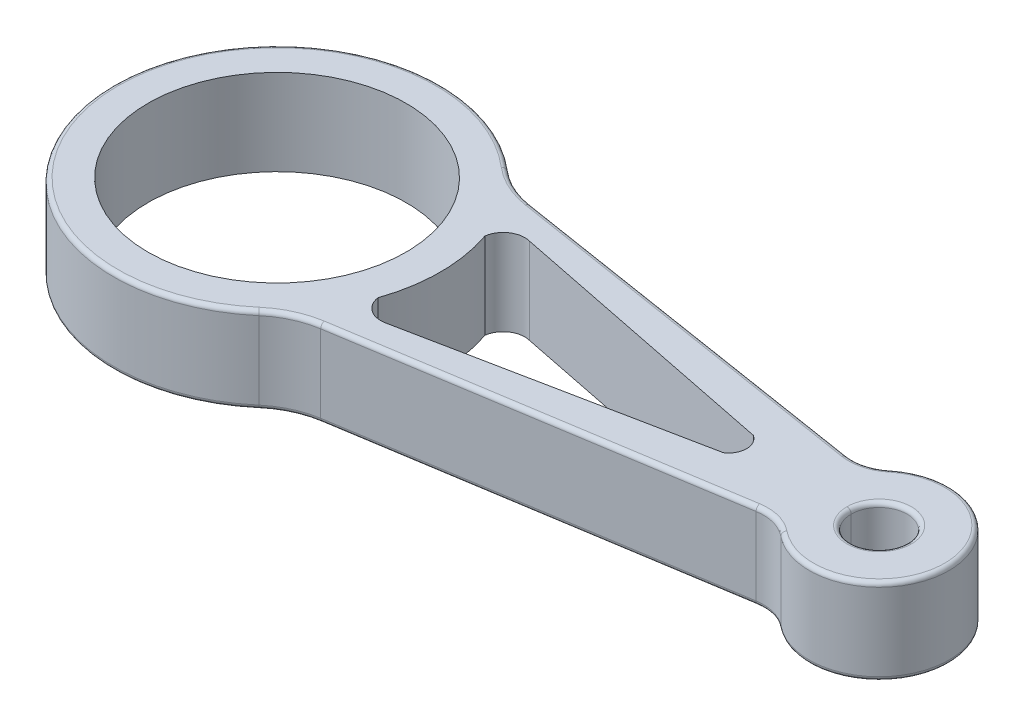
ISO-10303-21;
HEADER;
FILE_DESCRIPTION(('STEP AP214'),'2;1');
FILE_NAME('part.step','',(''),(''),'','','');
FILE_SCHEMA(('AUTOMOTIVE_DESIGN { 1 0 10303 214 1 1 1 1 }'));
ENDSEC;
DATA;
#1=APPLICATION_CONTEXT('core data for automotive mechanical design processes');
#2=APPLICATION_PROTOCOL_DEFINITION('international standard','automotive_design',2000,#1);
#3=PRODUCT_CONTEXT('',#1,'mechanical');
#4=PRODUCT('Part','Part','',(#3));
#5=PRODUCT_RELATED_PRODUCT_CATEGORY('part','',(#4));
#6=PRODUCT_DEFINITION_FORMATION('','',#4);
#7=PRODUCT_DEFINITION_CONTEXT('part definition',#1,'design');
#8=PRODUCT_DEFINITION('design','',#6,#7);
#9=PRODUCT_DEFINITION_SHAPE('','',#8);
#10=(LENGTH_UNIT() NAMED_UNIT(*) SI_UNIT(.MILLI.,.METRE.));
#11=(NAMED_UNIT(*) PLANE_ANGLE_UNIT() SI_UNIT($,.RADIAN.));
#12=(NAMED_UNIT(*) SI_UNIT($,.STERADIAN.) SOLID_ANGLE_UNIT());
#13=UNCERTAINTY_MEASURE_WITH_UNIT(LENGTH_MEASURE(1.E-05),#10,'distance_accuracy_value','');
#14=(GEOMETRIC_REPRESENTATION_CONTEXT(3) GLOBAL_UNCERTAINTY_ASSIGNED_CONTEXT((#13)) GLOBAL_UNIT_ASSIGNED_CONTEXT((#10,
#11,#12)) REPRESENTATION_CONTEXT('',''));
#15=CARTESIAN_POINT('',(0.,0.,0.));
#16=DIRECTION('',(0.,0.,1.));
#17=DIRECTION('',(1.,0.,0.));
#18=AXIS2_PLACEMENT_3D('',#15,#16,#17);
#19=CARTESIAN_POINT('',(140.,10.,0.));
#20=DIRECTION('',(0.,-1.,0.));
#21=DIRECTION('',(0.,0.,-1.));
#22=AXIS2_PLACEMENT_3D('',#19,#20,#21);
#23=CYLINDRICAL_SURFACE('',#22,6.50000000000002);
#24=DIRECTION('',(0.,1.,0.));
#25=VECTOR('',#24,1.);
#26=CARTESIAN_POINT('',(146.5,10.,0.));
#27=LINE('',#26,#25);
#28=CARTESIAN_POINT('',(146.5,-9.,0.));
#29=VERTEX_POINT('',#28);
#30=CARTESIAN_POINT('',(146.5,9.,0.));
#31=VERTEX_POINT('',#30);
#32=EDGE_CURVE('E304',#29,#31,#27,.T.);
#33=ORIENTED_EDGE('',*,*,#32,.T.);
#34=CARTESIAN_POINT('',(140.,9.,0.));
#35=DIRECTION('',(0.,1.,0.));
#36=DIRECTION('',(0.,0.,1.));
#37=AXIS2_PLACEMENT_3D('',#34,#35,#36);
#38=CIRCLE('',#37,6.50000000000002);
#39=CARTESIAN_POINT('',(133.5,9.,0.));
#40=VERTEX_POINT('',#39);
#41=EDGE_CURVE('E314',#31,#40,#38,.T.);
#42=ORIENTED_EDGE('',*,*,#41,.T.);
#43=DIRECTION('',(0.,-1.,0.));
#44=VECTOR('',#43,1.);
#45=CARTESIAN_POINT('',(133.5,10.,0.));
#46=LINE('',#45,#44);
#47=CARTESIAN_POINT('',(133.5,-9.,0.));
#48=VERTEX_POINT('',#47);
#49=EDGE_CURVE('E308',#40,#48,#46,.T.);
#50=ORIENTED_EDGE('',*,*,#49,.T.);
#51=CARTESIAN_POINT('',(140.,-9.,0.));
#52=DIRECTION('',(0.,1.,0.));
#53=DIRECTION('',(0.,0.,1.));
#54=AXIS2_PLACEMENT_3D('',#51,#52,#53);
#55=CIRCLE('',#54,6.50000000000002);
#56=EDGE_CURVE('E312',#48,#29,#55,.F.);
#57=ORIENTED_EDGE('',*,*,#56,.T.);
#58=EDGE_LOOP('',(#33,#42,#50,#57));
#59=FACE_BOUND('',#58,.T.);
#60=ADVANCED_FACE('F41',(#59),#23,.F.);
#61=CARTESIAN_POINT('',(0.,10.,0.));
#62=DIRECTION('',(0.,1.,0.));
#63=DIRECTION('',(0.,0.,1.));
#64=AXIS2_PLACEMENT_3D('',#61,#62,#63);
#65=PLANE('',#64);
#66=CARTESIAN_POINT('',(140.,10.,0.));
#67=DIRECTION('',(0.,1.,0.));
#68=DIRECTION('',(0.,0.,1.));
#69=AXIS2_PLACEMENT_3D('',#66,#67,#68);
#70=CIRCLE('',#69,7.50000000000002);
#71=CARTESIAN_POINT('',(147.5,10.,0.));
#72=VERTEX_POINT('',#71);
#73=CARTESIAN_POINT('',(132.5,10.,0.));
#74=VERTEX_POINT('',#73);
#75=EDGE_CURVE('E334',#72,#74,#70,.F.);
#76=ORIENTED_EDGE('',*,*,#75,.T.);
#77=CARTESIAN_POINT('',(140.,10.,0.));
#78=DIRECTION('',(0.,1.,0.));
#79=DIRECTION('',(0.,0.,1.));
#80=AXIS2_PLACEMENT_3D('',#77,#78,#79);
#81=CIRCLE('',#80,7.50000000000002);
#82=EDGE_CURVE('E336',#74,#72,#81,.F.);
#83=ORIENTED_EDGE('',*,*,#82,.T.);
#84=EDGE_LOOP('',(#76,#83));
#85=FACE_BOUND('',#84,.T.);
#86=DIRECTION('',(0.98768997143747,0.,-0.15642416795959));
#87=VECTOR('',#86,1.);
#88=CARTESIAN_POINT('',(121.760856010364,10.,9.53644901003842));
#89=LINE('',#88,#87);
#90=CARTESIAN_POINT('',(34.3647591369762,10.,23.3776969032807));
#91=VERTEX_POINT('',#90);
#92=CARTESIAN_POINT('',(121.760856010364,10.,9.53644901003843));
#93=VERTEX_POINT('',#92);
#94=EDGE_CURVE('E329',#91,#93,#89,.T.);
#95=ORIENTED_EDGE('',*,*,#94,.T.);
#96=CARTESIAN_POINT('',(123.481521857919,10.,20.4010386958506));
#97=DIRECTION('',(0.,1.,0.));
#98=DIRECTION('',(0.,0.,1.));
#99=AXIS2_PLACEMENT_3D('',#96,#97,#98);
#100=CIRCLE('',#99,11.);
#101=CARTESIAN_POINT('',(130.403550793648,10.,11.8520320042561));
#102=VERTEX_POINT('',#101);
#103=EDGE_CURVE('E331',#93,#102,#100,.F.);
#104=ORIENTED_EDGE('',*,*,#103,.T.);
#105=CARTESIAN_POINT('',(140.,10.,0.));
#106=DIRECTION('',(0.,1.,0.));
#107=DIRECTION('',(0.,0.,1.));
#108=AXIS2_PLACEMENT_3D('',#105,#106,#107);
#109=CIRCLE('',#108,15.25);
#110=CARTESIAN_POINT('',(130.403550793648,10.,-11.8520320042561));
#111=VERTEX_POINT('',#110);
#112=EDGE_CURVE('E317',#102,#111,#109,.T.);
#113=ORIENTED_EDGE('',*,*,#112,.T.);
#114=CARTESIAN_POINT('',(123.481521857919,10.,-20.4010386958506));
#115=DIRECTION('',(0.,1.,0.));
#116=DIRECTION('',(0.,0.,1.));
#117=AXIS2_PLACEMENT_3D('',#114,#115,#116);
#118=CIRCLE('',#117,11.);
#119=CARTESIAN_POINT('',(121.760856010364,10.,-9.53644901003843));
#120=VERTEX_POINT('',#119);
#121=EDGE_CURVE('E319',#111,#120,#118,.F.);
#122=ORIENTED_EDGE('',*,*,#121,.T.);
#123=DIRECTION('',(-0.98768997143747,0.,-0.15642416795959));
#124=VECTOR('',#123,1.);
#125=CARTESIAN_POINT('',(34.3647591369762,10.,-23.3776969032807));
#126=LINE('',#125,#124);
#127=CARTESIAN_POINT('',(34.3647591369762,10.,-23.3776969032807));
#128=VERTEX_POINT('',#127);
#129=EDGE_CURVE('E321',#120,#128,#126,.T.);
#130=ORIENTED_EDGE('',*,*,#129,.T.);
#131=CARTESIAN_POINT('',(37.6496666641276,10.,-44.1191863034676));
#132=DIRECTION('',(0.,1.,0.));
#133=DIRECTION('',(0.,0.,1.));
#134=AXIS2_PLACEMENT_3D('',#131,#132,#133);
#135=CIRCLE('',#134,21.);
#136=CARTESIAN_POINT('',(24.0178908029779,10.,-28.1449981591086));
#137=VERTEX_POINT('',#136);
#138=EDGE_CURVE('E323',#128,#137,#135,.F.);
#139=ORIENTED_EDGE('',*,*,#138,.T.);
#140=CARTESIAN_POINT('',(0.,10.,0.));
#141=DIRECTION('',(0.,1.,0.));
#142=DIRECTION('',(0.,0.,1.));
#143=AXIS2_PLACEMENT_3D('',#140,#141,#142);
#144=CIRCLE('',#143,37.);
#145=CARTESIAN_POINT('',(24.0178908029779,10.,28.1449981591086));
#146=VERTEX_POINT('',#145);
#147=EDGE_CURVE('E325',#137,#146,#144,.T.);
#148=ORIENTED_EDGE('',*,*,#147,.T.);
#149=CARTESIAN_POINT('',(37.6496666641276,10.,44.1191863034676));
#150=DIRECTION('',(0.,1.,0.));
#151=DIRECTION('',(0.,0.,1.));
#152=AXIS2_PLACEMENT_3D('',#149,#150,#151);
#153=CIRCLE('',#152,21.);
#154=EDGE_CURVE('E327',#146,#91,#153,.F.);
#155=ORIENTED_EDGE('',*,*,#154,.T.);
#156=EDGE_LOOP('',(#95,#104,#113,#122,#130,#139,#148,#155));
#157=FACE_BOUND('',#156,.T.);
#158=CARTESIAN_POINT('',(40.8525256208272,10.,-11.7407048710844));
#159=DIRECTION('',(0.,-1.,0.));
#160=DIRECTION('',(0.,0.,-1.));
#161=AXIS2_PLACEMENT_3D('',#158,#159,#160);
#162=CIRCLE('',#161,5.);
#163=CARTESIAN_POINT('',(35.9029509891441,10.,-12.4490204542813));
#164=VERTEX_POINT('',#163);
#165=CARTESIAN_POINT('',(42.0845930208549,10.,-16.5865288383565));
#166=VERTEX_POINT('',#165);
#167=EDGE_CURVE('E220',#164,#166,#162,.T.);
#168=ORIENTED_EDGE('',*,*,#167,.T.);
#169=DIRECTION('',(0.980410813958702,0.,0.196963539450417));
#170=VECTOR('',#169,1.);
#171=CARTESIAN_POINT('',(42.0845930208549,10.,-16.5865288383565));
#172=LINE('',#171,#170);
#173=CARTESIAN_POINT('',(107.258618966353,10.,-3.49313304172539));
#174=VERTEX_POINT('',#173);
#175=EDGE_CURVE('E232',#166,#174,#172,.T.);
#176=ORIENTED_EDGE('',*,*,#175,.T.);
#177=CARTESIAN_POINT('',(105.,10.,0.));
#178=DIRECTION('',(0.,-1.,0.));
#179=DIRECTION('',(0.,0.,-1.));
#180=AXIS2_PLACEMENT_3D('',#177,#178,#179);
#181=CIRCLE('',#180,4.15972812601523);
#182=CARTESIAN_POINT('',(107.258618966353,10.,3.49313304172539));
#183=VERTEX_POINT('',#182);
#184=EDGE_CURVE('E236',#174,#183,#181,.T.);
#185=ORIENTED_EDGE('',*,*,#184,.T.);
#186=DIRECTION('',(-0.980410813958702,0.,0.196963539450417));
#187=VECTOR('',#186,1.);
#188=CARTESIAN_POINT('',(42.0845930208549,10.,16.5865288383565));
#189=LINE('',#188,#187);
#190=CARTESIAN_POINT('',(42.0845930208549,10.,16.5865288383565));
#191=VERTEX_POINT('',#190);
#192=EDGE_CURVE('E249',#183,#191,#189,.T.);
#193=ORIENTED_EDGE('',*,*,#192,.T.);
#194=CARTESIAN_POINT('',(40.8525256208272,10.,11.7407048710844));
#195=DIRECTION('',(0.,-1.,0.));
#196=DIRECTION('',(0.,0.,1.));
#197=AXIS2_PLACEMENT_3D('',#194,#195,#196);
#198=CIRCLE('',#197,5.);
#199=CARTESIAN_POINT('',(35.9029509891441,10.,12.4490204542813));
#200=VERTEX_POINT('',#199);
#201=EDGE_CURVE('E252',#191,#200,#198,.T.);
#202=ORIENTED_EDGE('',*,*,#201,.T.);
#203=CARTESIAN_POINT('',(0.,10.,0.));
#204=DIRECTION('',(0.,1.,0.));
#205=DIRECTION('',(0.,0.,-1.));
#206=AXIS2_PLACEMENT_3D('',#203,#204,#205);
#207=CIRCLE('',#206,38.);
#208=EDGE_CURVE('E228',#200,#164,#207,.T.);
#209=ORIENTED_EDGE('',*,*,#208,.T.);
#210=EDGE_LOOP('',(#168,#176,#185,#193,#202,#209));
#211=FACE_BOUND('',#210,.T.);
#212=CARTESIAN_POINT('',(0.,10.,0.));
#213=DIRECTION('',(0.,1.,0.));
#214=DIRECTION('',(0.,0.,1.));
#215=AXIS2_PLACEMENT_3D('',#212,#213,#214);
#216=CIRCLE('',#215,30.);
#217=CARTESIAN_POINT('',(0.,10.,30.));
#218=VERTEX_POINT('',#217);
#219=EDGE_CURVE('E277',#218,#218,#216,.T.);
#220=ORIENTED_EDGE('',*,*,#219,.F.);
#221=EDGE_LOOP('',(#220));
#222=FACE_BOUND('',#221,.T.);
#223=ADVANCED_FACE('F238',(#85,#157,#211,#222),#65,.T.);
#224=CARTESIAN_POINT('',(0.,-10.,0.));
#225=DIRECTION('',(0.,1.,0.));
#226=DIRECTION('',(0.,0.,1.));
#227=AXIS2_PLACEMENT_3D('',#224,#225,#226);
#228=PLANE('',#227);
#229=CARTESIAN_POINT('',(140.,-10.,0.));
#230=DIRECTION('',(0.,1.,0.));
#231=DIRECTION('',(0.,0.,1.));
#232=AXIS2_PLACEMENT_3D('',#229,#230,#231);
#233=CIRCLE('',#232,7.50000000000002);
#234=CARTESIAN_POINT('',(147.5,-10.,0.));
#235=VERTEX_POINT('',#234);
#236=CARTESIAN_POINT('',(132.5,-10.,0.));
#237=VERTEX_POINT('',#236);
#238=EDGE_CURVE('E356',#235,#237,#233,.T.);
#239=ORIENTED_EDGE('',*,*,#238,.T.);
#240=CARTESIAN_POINT('',(140.,-10.,0.));
#241=DIRECTION('',(0.,1.,0.));
#242=DIRECTION('',(0.,0.,1.));
#243=AXIS2_PLACEMENT_3D('',#240,#241,#242);
#244=CIRCLE('',#243,7.50000000000002);
#245=EDGE_CURVE('E358',#237,#235,#244,.T.);
#246=ORIENTED_EDGE('',*,*,#245,.T.);
#247=EDGE_LOOP('',(#239,#246));
#248=FACE_BOUND('',#247,.T.);
#249=CARTESIAN_POINT('',(140.,-10.,0.));
#250=DIRECTION('',(0.,1.,0.));
#251=DIRECTION('',(0.,0.,1.));
#252=AXIS2_PLACEMENT_3D('',#249,#250,#251);
#253=CIRCLE('',#252,15.25);
#254=CARTESIAN_POINT('',(130.403550793648,-10.,-11.8520320042561));
#255=VERTEX_POINT('',#254);
#256=CARTESIAN_POINT('',(130.403550793648,-10.,11.8520320042561));
#257=VERTEX_POINT('',#256);
#258=EDGE_CURVE('E339',#255,#257,#253,.F.);
#259=ORIENTED_EDGE('',*,*,#258,.T.);
#260=CARTESIAN_POINT('',(123.481521857919,-10.,20.4010386958506));
#261=DIRECTION('',(0.,1.,0.));
#262=DIRECTION('',(0.,0.,1.));
#263=AXIS2_PLACEMENT_3D('',#260,#261,#262);
#264=CIRCLE('',#263,11.);
#265=CARTESIAN_POINT('',(121.760856010364,-10.,9.53644901003843));
#266=VERTEX_POINT('',#265);
#267=EDGE_CURVE('E353',#257,#266,#264,.T.);
#268=ORIENTED_EDGE('',*,*,#267,.T.);
#269=DIRECTION('',(0.98768997143747,0.,-0.15642416795959));
#270=VECTOR('',#269,1.);
#271=CARTESIAN_POINT('',(4.45267582891042,-10.,28.114985808414));
#272=LINE('',#271,#270);
#273=CARTESIAN_POINT('',(34.3647591369762,-10.,23.3776969032807));
#274=VERTEX_POINT('',#273);
#275=EDGE_CURVE('E351',#266,#274,#272,.F.);
#276=ORIENTED_EDGE('',*,*,#275,.T.);
#277=CARTESIAN_POINT('',(37.6496666641276,-10.,44.1191863034676));
#278=DIRECTION('',(0.,1.,0.));
#279=DIRECTION('',(0.,0.,1.));
#280=AXIS2_PLACEMENT_3D('',#277,#278,#279);
#281=CIRCLE('',#280,21.);
#282=CARTESIAN_POINT('',(24.0178908029779,-10.,28.1449981591086));
#283=VERTEX_POINT('',#282);
#284=EDGE_CURVE('E349',#274,#283,#281,.T.);
#285=ORIENTED_EDGE('',*,*,#284,.T.);
#286=CARTESIAN_POINT('',(0.,-10.,0.));
#287=DIRECTION('',(0.,1.,0.));
#288=DIRECTION('',(0.,0.,1.));
#289=AXIS2_PLACEMENT_3D('',#286,#287,#288);
#290=CIRCLE('',#289,37.);
#291=CARTESIAN_POINT('',(24.0178908029779,-10.,-28.1449981591086));
#292=VERTEX_POINT('',#291);
#293=EDGE_CURVE('E347',#283,#292,#290,.F.);
#294=ORIENTED_EDGE('',*,*,#293,.T.);
#295=CARTESIAN_POINT('',(37.6496666641276,-10.,-44.1191863034676));
#296=DIRECTION('',(0.,1.,0.));
#297=DIRECTION('',(0.,0.,1.));
#298=AXIS2_PLACEMENT_3D('',#295,#296,#297);
#299=CIRCLE('',#298,21.);
#300=CARTESIAN_POINT('',(34.3647591369762,-10.,-23.3776969032807));
#301=VERTEX_POINT('',#300);
#302=EDGE_CURVE('E345',#292,#301,#299,.T.);
#303=ORIENTED_EDGE('',*,*,#302,.T.);
#304=DIRECTION('',(-0.98768997143747,0.,-0.15642416795959));
#305=VECTOR('',#304,1.);
#306=CARTESIAN_POINT('',(4.45267582891042,-10.,-28.114985808414));
#307=LINE('',#306,#305);
#308=CARTESIAN_POINT('',(121.760856010364,-10.,-9.53644901003843));
#309=VERTEX_POINT('',#308);
#310=EDGE_CURVE('E343',#301,#309,#307,.F.);
#311=ORIENTED_EDGE('',*,*,#310,.T.);
#312=CARTESIAN_POINT('',(123.481521857919,-10.,-20.4010386958506));
#313=DIRECTION('',(0.,1.,0.));
#314=DIRECTION('',(0.,0.,1.));
#315=AXIS2_PLACEMENT_3D('',#312,#313,#314);
#316=CIRCLE('',#315,11.);
#317=EDGE_CURVE('E341',#309,#255,#316,.T.);
#318=ORIENTED_EDGE('',*,*,#317,.T.);
#319=EDGE_LOOP('',(#259,#268,#276,#285,#294,#303,#311,#318));
#320=FACE_BOUND('',#319,.T.);
#321=DIRECTION('',(0.980410813958702,0.,0.196963539450417));
#322=VECTOR('',#321,1.);
#323=CARTESIAN_POINT('',(42.0845930208549,-10.,-16.5865288383565));
#324=LINE('',#323,#322);
#325=CARTESIAN_POINT('',(42.0845930208549,-10.,-16.5865288383565));
#326=VERTEX_POINT('',#325);
#327=CARTESIAN_POINT('',(107.258618966353,-10.,-3.49313304172539));
#328=VERTEX_POINT('',#327);
#329=EDGE_CURVE('E256',#326,#328,#324,.T.);
#330=ORIENTED_EDGE('',*,*,#329,.F.);
#331=CARTESIAN_POINT('',(40.8525256208272,-10.,-11.7407048710844));
#332=DIRECTION('',(0.,-1.,0.));
#333=DIRECTION('',(0.,0.,-1.));
#334=AXIS2_PLACEMENT_3D('',#331,#332,#333);
#335=CIRCLE('',#334,5.);
#336=CARTESIAN_POINT('',(35.9029509891441,-10.,-12.4490204542813));
#337=VERTEX_POINT('',#336);
#338=EDGE_CURVE('E223',#337,#326,#335,.T.);
#339=ORIENTED_EDGE('',*,*,#338,.F.);
#340=CARTESIAN_POINT('',(0.,-10.,0.));
#341=DIRECTION('',(0.,1.,0.));
#342=DIRECTION('',(0.,0.,-1.));
#343=AXIS2_PLACEMENT_3D('',#340,#341,#342);
#344=CIRCLE('',#343,38.);
#345=CARTESIAN_POINT('',(35.9029509891441,-10.,12.4490204542813));
#346=VERTEX_POINT('',#345);
#347=EDGE_CURVE('E242',#346,#337,#344,.T.);
#348=ORIENTED_EDGE('',*,*,#347,.F.);
#349=CARTESIAN_POINT('',(40.8525256208272,-10.,11.7407048710844));
#350=DIRECTION('',(0.,-1.,0.));
#351=DIRECTION('',(0.,0.,1.));
#352=AXIS2_PLACEMENT_3D('',#349,#350,#351);
#353=CIRCLE('',#352,5.);
#354=CARTESIAN_POINT('',(42.0845930208549,-10.,16.5865288383565));
#355=VERTEX_POINT('',#354);
#356=EDGE_CURVE('E245',#355,#346,#353,.T.);
#357=ORIENTED_EDGE('',*,*,#356,.F.);
#358=DIRECTION('',(-0.980410813958702,0.,0.196963539450417));
#359=VECTOR('',#358,1.);
#360=CARTESIAN_POINT('',(42.0845930208549,-10.,16.5865288383565));
#361=LINE('',#360,#359);
#362=CARTESIAN_POINT('',(107.258618966353,-10.,3.49313304172539));
#363=VERTEX_POINT('',#362);
#364=EDGE_CURVE('E262',#363,#355,#361,.T.);
#365=ORIENTED_EDGE('',*,*,#364,.F.);
#366=CARTESIAN_POINT('',(105.,-10.,0.));
#367=DIRECTION('',(0.,-1.,0.));
#368=DIRECTION('',(0.,0.,-1.));
#369=AXIS2_PLACEMENT_3D('',#366,#367,#368);
#370=CIRCLE('',#369,4.15972812601523);
#371=EDGE_CURVE('E259',#328,#363,#370,.T.);
#372=ORIENTED_EDGE('',*,*,#371,.F.);
#373=EDGE_LOOP('',(#330,#339,#348,#357,#365,#372));
#374=FACE_BOUND('',#373,.T.);
#375=CARTESIAN_POINT('',(0.,-10.,0.));
#376=DIRECTION('',(0.,1.,0.));
#377=DIRECTION('',(0.,0.,1.));
#378=AXIS2_PLACEMENT_3D('',#375,#376,#377);
#379=CIRCLE('',#378,30.);
#380=CARTESIAN_POINT('',(0.,-10.,30.));
#381=VERTEX_POINT('',#380);
#382=EDGE_CURVE('E269',#381,#381,#379,.T.);
#383=ORIENTED_EDGE('',*,*,#382,.T.);
#384=EDGE_LOOP('',(#383));
#385=FACE_BOUND('',#384,.T.);
#386=ADVANCED_FACE('F476',(#248,#320,#374,#385),#228,.F.);
#387=CARTESIAN_POINT('',(0.,10.,0.));
#388=DIRECTION('',(0.,-1.,0.));
#389=DIRECTION('',(0.,0.,-1.));
#390=AXIS2_PLACEMENT_3D('',#387,#388,#389);
#391=CYLINDRICAL_SURFACE('',#390,38.);
#392=DIRECTION('',(0.,-1.,0.));
#393=VECTOR('',#392,1.);
#394=CARTESIAN_POINT('',(24.6670229868422,10.,-28.9056737850305));
#395=LINE('',#394,#393);
#396=CARTESIAN_POINT('',(24.6670229868422,9.,-28.9056737850305));
#397=VERTEX_POINT('',#396);
#398=CARTESIAN_POINT('',(24.6670229868422,-9.,-28.9056737850305));
#399=VERTEX_POINT('',#398);
#400=EDGE_CURVE('E285',#397,#399,#395,.T.);
#401=ORIENTED_EDGE('',*,*,#400,.T.);
#402=CARTESIAN_POINT('',(0.,-9.,0.));
#403=DIRECTION('',(0.,1.,0.));
#404=DIRECTION('',(0.,0.,1.));
#405=AXIS2_PLACEMENT_3D('',#402,#403,#404);
#406=CIRCLE('',#405,38.);
#407=CARTESIAN_POINT('',(24.6670229868422,-9.,28.9056737850305));
#408=VERTEX_POINT('',#407);
#409=EDGE_CURVE('E382',#399,#408,#406,.T.);
#410=ORIENTED_EDGE('',*,*,#409,.T.);
#411=DIRECTION('',(0.,-1.,0.));
#412=VECTOR('',#411,1.);
#413=CARTESIAN_POINT('',(24.6670229868422,10.,28.9056737850305));
#414=LINE('',#413,#412);
#415=CARTESIAN_POINT('',(24.6670229868422,9.,28.9056737850305));
#416=VERTEX_POINT('',#415);
#417=EDGE_CURVE('E280',#408,#416,#414,.F.);
#418=ORIENTED_EDGE('',*,*,#417,.T.);
#419=CARTESIAN_POINT('',(0.,9.,0.));
#420=DIRECTION('',(0.,1.,0.));
#421=DIRECTION('',(0.,0.,1.));
#422=AXIS2_PLACEMENT_3D('',#419,#420,#421);
#423=CIRCLE('',#422,38.);
#424=EDGE_CURVE('E380',#416,#397,#423,.F.);
#425=ORIENTED_EDGE('',*,*,#424,.T.);
#426=EDGE_LOOP('',(#401,#410,#418,#425));
#427=FACE_BOUND('',#426,.T.);
#428=ADVANCED_FACE('F486',(#427),#391,.T.);
#429=CARTESIAN_POINT('',(28.3093472341479,10.,25.3491786686757));
#430=DIRECTION('',(-0.15642416795959,0.,-0.98768997143747));
#431=DIRECTION('',(-0.98768997143747,0.,0.15642416795959));
#432=AXIS2_PLACEMENT_3D('',#429,#430,#431);
#433=PLANE('',#432);
#434=DIRECTION('',(0.,1.,0.));
#435=VECTOR('',#434,1.);
#436=CARTESIAN_POINT('',(34.5211833049358,-10.,24.3653868747181));
#437=LINE('',#436,#435);
#438=CARTESIAN_POINT('',(34.5211833049358,9.,24.3653868747181));
#439=VERTEX_POINT('',#438);
#440=CARTESIAN_POINT('',(34.5211833049358,-9.,24.3653868747181));
#441=VERTEX_POINT('',#440);
#442=EDGE_CURVE('E291',#439,#441,#437,.F.);
#443=ORIENTED_EDGE('',*,*,#442,.T.);
#444=DIRECTION('',(0.98768997143747,0.,-0.15642416795959));
#445=VECTOR('',#444,1.);
#446=CARTESIAN_POINT('',(28.3093472341479,-9.,25.3491786686757));
#447=LINE('',#446,#445);
#448=CARTESIAN_POINT('',(121.917280178323,-9.,10.5241389814759));
#449=VERTEX_POINT('',#448);
#450=EDGE_CURVE('E374',#441,#449,#447,.T.);
#451=ORIENTED_EDGE('',*,*,#450,.T.);
#452=DIRECTION('',(0.,1.,0.));
#453=VECTOR('',#452,1.);
#454=CARTESIAN_POINT('',(121.917280178323,10.,10.5241389814759));
#455=LINE('',#454,#453);
#456=CARTESIAN_POINT('',(121.917280178323,9.,10.5241389814759));
#457=VERTEX_POINT('',#456);
#458=EDGE_CURVE('E301',#449,#457,#455,.T.);
#459=ORIENTED_EDGE('',*,*,#458,.T.);
#460=DIRECTION('',(0.98768997143747,0.,-0.15642416795959));
#461=VECTOR('',#460,1.);
#462=CARTESIAN_POINT('',(34.5211833049358,9.,24.3653868747181));
#463=LINE('',#462,#461);
#464=EDGE_CURVE('E372',#457,#439,#463,.F.);
#465=ORIENTED_EDGE('',*,*,#464,.T.);
#466=EDGE_LOOP('',(#443,#451,#459,#465));
#467=FACE_BOUND('',#466,.T.);
#468=ADVANCED_FACE('F507',(#467),#433,.F.);
#469=CARTESIAN_POINT('',(140.,10.,0.));
#470=DIRECTION('',(0.,-1.,0.));
#471=DIRECTION('',(0.,0.,-1.));
#472=AXIS2_PLACEMENT_3D('',#469,#470,#471);
#473=CYLINDRICAL_SURFACE('',#472,16.25);
#474=DIRECTION('',(0.,-1.,0.));
#475=VECTOR('',#474,1.);
#476=CARTESIAN_POINT('',(129.774275435855,10.,12.6292144307647));
#477=LINE('',#476,#475);
#478=CARTESIAN_POINT('',(129.774275435855,9.,12.6292144307647));
#479=VERTEX_POINT('',#478);
#480=CARTESIAN_POINT('',(129.774275435855,-9.,12.6292144307647));
#481=VERTEX_POINT('',#480);
#482=EDGE_CURVE('E297',#479,#481,#477,.T.);
#483=ORIENTED_EDGE('',*,*,#482,.T.);
#484=CARTESIAN_POINT('',(140.,-9.,0.));
#485=DIRECTION('',(0.,1.,0.));
#486=DIRECTION('',(0.,0.,1.));
#487=AXIS2_PLACEMENT_3D('',#484,#485,#486);
#488=CIRCLE('',#487,16.25);
#489=CARTESIAN_POINT('',(129.774275435855,-9.,-12.6292144307647));
#490=VERTEX_POINT('',#489);
#491=EDGE_CURVE('E11',#481,#490,#488,.T.);
#492=ORIENTED_EDGE('',*,*,#491,.T.);
#493=DIRECTION('',(0.,-1.,0.));
#494=VECTOR('',#493,1.);
#495=CARTESIAN_POINT('',(129.774275435855,10.,-12.6292144307647));
#496=LINE('',#495,#494);
#497=CARTESIAN_POINT('',(129.774275435855,9.,-12.6292144307647));
#498=VERTEX_POINT('',#497);
#499=EDGE_CURVE('E299',#490,#498,#496,.F.);
#500=ORIENTED_EDGE('',*,*,#499,.T.);
#501=CARTESIAN_POINT('',(140.,9.,0.));
#502=DIRECTION('',(0.,1.,0.));
#503=DIRECTION('',(0.,0.,1.));
#504=AXIS2_PLACEMENT_3D('',#501,#502,#503);
#505=CIRCLE('',#504,16.25);
#506=EDGE_CURVE('E50',#498,#479,#505,.F.);
#507=ORIENTED_EDGE('',*,*,#506,.T.);
#508=EDGE_LOOP('',(#483,#492,#500,#507));
#509=FACE_BOUND('',#508,.T.);
#510=ADVANCED_FACE('F570',(#509),#473,.T.);
#511=CARTESIAN_POINT('',(28.3093472341479,10.,-25.3491786686757));
#512=DIRECTION('',(-0.15642416795959,0.,0.98768997143747));
#513=DIRECTION('',(0.98768997143747,0.,0.15642416795959));
#514=AXIS2_PLACEMENT_3D('',#511,#512,#513);
#515=PLANE('',#514);
#516=DIRECTION('',(0.,1.,0.));
#517=VECTOR('',#516,1.);
#518=CARTESIAN_POINT('',(121.917280178323,-10.,-10.5241389814759));
#519=LINE('',#518,#517);
#520=CARTESIAN_POINT('',(121.917280178323,9.,-10.5241389814759));
#521=VERTEX_POINT('',#520);
#522=CARTESIAN_POINT('',(121.917280178323,-9.,-10.5241389814759));
#523=VERTEX_POINT('',#522);
#524=EDGE_CURVE('E294',#521,#523,#519,.F.);
#525=ORIENTED_EDGE('',*,*,#524,.T.);
#526=DIRECTION('',(-0.98768997143747,0.,-0.15642416795959));
#527=VECTOR('',#526,1.);
#528=CARTESIAN_POINT('',(28.3093472341479,-9.,-25.3491786686757));
#529=LINE('',#528,#527);
#530=CARTESIAN_POINT('',(34.5211833049358,-9.,-24.3653868747181));
#531=VERTEX_POINT('',#530);
#532=EDGE_CURVE('E390',#523,#531,#529,.T.);
#533=ORIENTED_EDGE('',*,*,#532,.T.);
#534=DIRECTION('',(0.,1.,0.));
#535=VECTOR('',#534,1.);
#536=CARTESIAN_POINT('',(34.5211833049358,10.,-24.3653868747181));
#537=LINE('',#536,#535);
#538=CARTESIAN_POINT('',(34.5211833049358,9.,-24.3653868747181));
#539=VERTEX_POINT('',#538);
#540=EDGE_CURVE('E288',#531,#539,#537,.T.);
#541=ORIENTED_EDGE('',*,*,#540,.T.);
#542=DIRECTION('',(-0.98768997143747,0.,-0.15642416795959));
#543=VECTOR('',#542,1.);
#544=CARTESIAN_POINT('',(121.917280178323,9.,-10.5241389814759));
#545=LINE('',#544,#543);
#546=EDGE_CURVE('E388',#539,#521,#545,.F.);
#547=ORIENTED_EDGE('',*,*,#546,.T.);
#548=EDGE_LOOP('',(#525,#533,#541,#547));
#549=FACE_BOUND('',#548,.T.);
#550=ADVANCED_FACE('F462',(#549),#515,.F.);
#551=CARTESIAN_POINT('',(0.,10.,0.));
#552=DIRECTION('',(0.,-1.,0.));
#553=DIRECTION('',(0.,0.,-1.));
#554=AXIS2_PLACEMENT_3D('',#551,#552,#553);
#555=CYLINDRICAL_SURFACE('',#554,30.);
#556=ORIENTED_EDGE('',*,*,#219,.T.);
#557=EDGE_LOOP('',(#556));
#558=FACE_BOUND('',#557,.T.);
#559=ORIENTED_EDGE('',*,*,#382,.F.);
#560=EDGE_LOOP('',(#559));
#561=FACE_BOUND('',#560,.T.);
#562=ADVANCED_FACE('F538',(#558,#561),#555,.F.);
#563=ORIENTED_EDGE('',*,*,#32,.F.);
#564=CARTESIAN_POINT('',(140.,-9.,0.));
#565=DIRECTION('',(0.,1.,0.));
#566=DIRECTION('',(0.,0.,1.));
#567=AXIS2_PLACEMENT_3D('',#564,#565,#566);
#568=CIRCLE('',#567,6.50000000000002);
#569=EDGE_CURVE('E363',#29,#48,#568,.F.);
#570=ORIENTED_EDGE('',*,*,#569,.T.);
#571=ORIENTED_EDGE('',*,*,#49,.F.);
#572=CARTESIAN_POINT('',(140.,9.,0.));
#573=DIRECTION('',(0.,1.,0.));
#574=DIRECTION('',(0.,0.,1.));
#575=AXIS2_PLACEMENT_3D('',#572,#573,#574);
#576=CIRCLE('',#575,6.50000000000002);
#577=EDGE_CURVE('E361',#40,#31,#576,.T.);
#578=ORIENTED_EDGE('',*,*,#577,.T.);
#579=EDGE_LOOP('',(#563,#570,#571,#578));
#580=FACE_BOUND('',#579,.T.);
#581=ADVANCED_FACE('F529',(#580),#23,.F.);
#582=CARTESIAN_POINT('',(37.6496666641276,10.,-44.1191863034676));
#583=DIRECTION('',(0.,-1.,0.));
#584=DIRECTION('',(0.,0.,-1.));
#585=AXIS2_PLACEMENT_3D('',#582,#583,#584);
#586=CYLINDRICAL_SURFACE('',#585,20.);
#587=ORIENTED_EDGE('',*,*,#540,.F.);
#588=CARTESIAN_POINT('',(37.6496666641276,-9.,-44.1191863034676));
#589=DIRECTION('',(0.,1.,0.));
#590=DIRECTION('',(0.,0.,1.));
#591=AXIS2_PLACEMENT_3D('',#588,#589,#590);
#592=CIRCLE('',#591,20.);
#593=EDGE_CURVE('E386',#531,#399,#592,.F.);
#594=ORIENTED_EDGE('',*,*,#593,.T.);
#595=ORIENTED_EDGE('',*,*,#400,.F.);
#596=CARTESIAN_POINT('',(37.6496666641276,9.,-44.1191863034676));
#597=DIRECTION('',(0.,1.,0.));
#598=DIRECTION('',(0.,0.,1.));
#599=AXIS2_PLACEMENT_3D('',#596,#597,#598);
#600=CIRCLE('',#599,20.);
#601=EDGE_CURVE('E384',#397,#539,#600,.T.);
#602=ORIENTED_EDGE('',*,*,#601,.T.);
#603=EDGE_LOOP('',(#587,#594,#595,#602));
#604=FACE_BOUND('',#603,.T.);
#605=ADVANCED_FACE('F459',(#604),#586,.F.);
#606=CARTESIAN_POINT('',(37.6496666641276,10.,44.1191863034676));
#607=DIRECTION('',(0.,-1.,0.));
#608=DIRECTION('',(0.,0.,-1.));
#609=AXIS2_PLACEMENT_3D('',#606,#607,#608);
#610=CYLINDRICAL_SURFACE('',#609,20.);
#611=ORIENTED_EDGE('',*,*,#417,.F.);
#612=CARTESIAN_POINT('',(37.6496666641276,-9.,44.1191863034676));
#613=DIRECTION('',(0.,1.,0.));
#614=DIRECTION('',(0.,0.,1.));
#615=AXIS2_PLACEMENT_3D('',#612,#613,#614);
#616=CIRCLE('',#615,20.);
#617=EDGE_CURVE('E378',#408,#441,#616,.F.);
#618=ORIENTED_EDGE('',*,*,#617,.T.);
#619=ORIENTED_EDGE('',*,*,#442,.F.);
#620=CARTESIAN_POINT('',(37.6496666641276,9.,44.1191863034676));
#621=DIRECTION('',(0.,1.,0.));
#622=DIRECTION('',(0.,0.,1.));
#623=AXIS2_PLACEMENT_3D('',#620,#621,#622);
#624=CIRCLE('',#623,20.);
#625=EDGE_CURVE('E376',#439,#416,#624,.T.);
#626=ORIENTED_EDGE('',*,*,#625,.T.);
#627=EDGE_LOOP('',(#611,#618,#619,#626));
#628=FACE_BOUND('',#627,.T.);
#629=ADVANCED_FACE('F490',(#628),#610,.F.);
#630=CARTESIAN_POINT('',(123.481521857919,10.,-20.4010386958506));
#631=DIRECTION('',(0.,-1.,0.));
#632=DIRECTION('',(0.,0.,-1.));
#633=AXIS2_PLACEMENT_3D('',#630,#631,#632);
#634=CYLINDRICAL_SURFACE('',#633,10.);
#635=ORIENTED_EDGE('',*,*,#499,.F.);
#636=CARTESIAN_POINT('',(123.481521857919,-9.,-20.4010386958506));
#637=DIRECTION('',(0.,1.,0.));
#638=DIRECTION('',(0.,0.,1.));
#639=AXIS2_PLACEMENT_3D('',#636,#637,#638);
#640=CIRCLE('',#639,10.);
#641=EDGE_CURVE('E393',#490,#523,#640,.F.);
#642=ORIENTED_EDGE('',*,*,#641,.T.);
#643=ORIENTED_EDGE('',*,*,#524,.F.);
#644=CARTESIAN_POINT('',(123.481521857919,9.,-20.4010386958506));
#645=DIRECTION('',(0.,1.,0.));
#646=DIRECTION('',(0.,0.,1.));
#647=AXIS2_PLACEMENT_3D('',#644,#645,#646);
#648=CIRCLE('',#647,10.);
#649=EDGE_CURVE('E58',#521,#498,#648,.T.);
#650=ORIENTED_EDGE('',*,*,#649,.T.);
#651=EDGE_LOOP('',(#635,#642,#643,#650));
#652=FACE_BOUND('',#651,.T.);
#653=ADVANCED_FACE('F577',(#652),#634,.F.);
#654=CARTESIAN_POINT('',(123.481521857919,10.,20.4010386958506));
#655=DIRECTION('',(0.,-1.,0.));
#656=DIRECTION('',(0.,0.,-1.));
#657=AXIS2_PLACEMENT_3D('',#654,#655,#656);
#658=CYLINDRICAL_SURFACE('',#657,10.);
#659=ORIENTED_EDGE('',*,*,#458,.F.);
#660=CARTESIAN_POINT('',(123.481521857919,-9.,20.4010386958506));
#661=DIRECTION('',(0.,1.,0.));
#662=DIRECTION('',(0.,0.,1.));
#663=AXIS2_PLACEMENT_3D('',#660,#661,#662);
#664=CIRCLE('',#663,10.);
#665=EDGE_CURVE('E369',#449,#481,#664,.F.);
#666=ORIENTED_EDGE('',*,*,#665,.T.);
#667=ORIENTED_EDGE('',*,*,#482,.F.);
#668=CARTESIAN_POINT('',(123.481521857919,9.,20.4010386958506));
#669=DIRECTION('',(0.,1.,0.));
#670=DIRECTION('',(0.,0.,1.));
#671=AXIS2_PLACEMENT_3D('',#668,#669,#670);
#672=CIRCLE('',#671,10.);
#673=EDGE_CURVE('E366',#479,#457,#672,.T.);
#674=ORIENTED_EDGE('',*,*,#673,.T.);
#675=EDGE_LOOP('',(#659,#666,#667,#674));
#676=FACE_BOUND('',#675,.T.);
#677=ADVANCED_FACE('F510',(#676),#658,.F.);
#678=CARTESIAN_POINT('',(40.8525256208272,10.,-11.7407048710844));
#679=DIRECTION('',(0.,-1.,0.));
#680=DIRECTION('',(0.,0.,-1.));
#681=AXIS2_PLACEMENT_3D('',#678,#679,#680);
#682=CYLINDRICAL_SURFACE('',#681,5.);
#683=ORIENTED_EDGE('',*,*,#338,.T.);
#684=DIRECTION('',(0.,-1.,0.));
#685=VECTOR('',#684,1.);
#686=CARTESIAN_POINT('',(42.0845930208549,10.,-16.5865288383565));
#687=LINE('',#686,#685);
#688=EDGE_CURVE('E216',#166,#326,#687,.T.);
#689=ORIENTED_EDGE('',*,*,#688,.F.);
#690=ORIENTED_EDGE('',*,*,#167,.F.);
#691=DIRECTION('',(0.,-1.,0.));
#692=VECTOR('',#691,1.);
#693=CARTESIAN_POINT('',(35.9029509891441,10.,-12.4490204542813));
#694=LINE('',#693,#692);
#695=EDGE_CURVE('E267',#164,#337,#694,.T.);
#696=ORIENTED_EDGE('',*,*,#695,.T.);
#697=EDGE_LOOP('',(#683,#689,#690,#696));
#698=FACE_BOUND('',#697,.T.);
#699=ADVANCED_FACE('F218',(#698),#682,.F.);
#700=CARTESIAN_POINT('',(0.,10.,0.));
#701=DIRECTION('',(0.,-1.,0.));
#702=DIRECTION('',(0.,0.,-1.));
#703=AXIS2_PLACEMENT_3D('',#700,#701,#702);
#704=CYLINDRICAL_SURFACE('',#703,38.);
#705=ORIENTED_EDGE('',*,*,#347,.T.);
#706=ORIENTED_EDGE('',*,*,#695,.F.);
#707=ORIENTED_EDGE('',*,*,#208,.F.);
#708=DIRECTION('',(0.,-1.,0.));
#709=VECTOR('',#708,1.);
#710=CARTESIAN_POINT('',(35.9029509891441,10.,12.4490204542813));
#711=LINE('',#710,#709);
#712=EDGE_CURVE('E270',#200,#346,#711,.T.);
#713=ORIENTED_EDGE('',*,*,#712,.T.);
#714=EDGE_LOOP('',(#705,#706,#707,#713));
#715=FACE_BOUND('',#714,.T.);
#716=ADVANCED_FACE('F782',(#715),#704,.T.);
#717=CARTESIAN_POINT('',(40.8525256208272,10.,11.7407048710844));
#718=DIRECTION('',(0.,-1.,0.));
#719=DIRECTION('',(0.,0.,-1.));
#720=AXIS2_PLACEMENT_3D('',#717,#718,#719);
#721=CYLINDRICAL_SURFACE('',#720,5.);
#722=ORIENTED_EDGE('',*,*,#356,.T.);
#723=ORIENTED_EDGE('',*,*,#712,.F.);
#724=ORIENTED_EDGE('',*,*,#201,.F.);
#725=DIRECTION('',(0.,-1.,0.));
#726=VECTOR('',#725,1.);
#727=CARTESIAN_POINT('',(42.0845930208549,10.,16.5865288383565));
#728=LINE('',#727,#726);
#729=EDGE_CURVE('E272',#191,#355,#728,.T.);
#730=ORIENTED_EDGE('',*,*,#729,.T.);
#731=EDGE_LOOP('',(#722,#723,#724,#730));
#732=FACE_BOUND('',#731,.T.);
#733=ADVANCED_FACE('F788',(#732),#721,.F.);
#734=CARTESIAN_POINT('',(42.0845930208549,10.,16.5865288383565));
#735=DIRECTION('',(0.196963539450417,0.,0.980410813958702));
#736=DIRECTION('',(0.980410813958702,0.,-0.196963539450417));
#737=AXIS2_PLACEMENT_3D('',#734,#735,#736);
#738=PLANE('',#737);
#739=ORIENTED_EDGE('',*,*,#364,.T.);
#740=ORIENTED_EDGE('',*,*,#729,.F.);
#741=ORIENTED_EDGE('',*,*,#192,.F.);
#742=DIRECTION('',(0.,-1.,0.));
#743=VECTOR('',#742,1.);
#744=CARTESIAN_POINT('',(107.258618966353,10.,3.49313304172539));
#745=LINE('',#744,#743);
#746=EDGE_CURVE('E274',#183,#363,#745,.T.);
#747=ORIENTED_EDGE('',*,*,#746,.T.);
#748=EDGE_LOOP('',(#739,#740,#741,#747));
#749=FACE_BOUND('',#748,.T.);
#750=ADVANCED_FACE('F796',(#749),#738,.F.);
#751=CARTESIAN_POINT('',(105.,10.,0.));
#752=DIRECTION('',(0.,-1.,0.));
#753=DIRECTION('',(0.,0.,-1.));
#754=AXIS2_PLACEMENT_3D('',#751,#752,#753);
#755=CYLINDRICAL_SURFACE('',#754,4.15972812601523);
#756=ORIENTED_EDGE('',*,*,#371,.T.);
#757=ORIENTED_EDGE('',*,*,#746,.F.);
#758=ORIENTED_EDGE('',*,*,#184,.F.);
#759=DIRECTION('',(0.,-1.,0.));
#760=VECTOR('',#759,1.);
#761=CARTESIAN_POINT('',(107.258618966353,10.,-3.49313304172539));
#762=LINE('',#761,#760);
#763=EDGE_CURVE('E227',#174,#328,#762,.T.);
#764=ORIENTED_EDGE('',*,*,#763,.T.);
#765=EDGE_LOOP('',(#756,#757,#758,#764));
#766=FACE_BOUND('',#765,.T.);
#767=ADVANCED_FACE('F804',(#766),#755,.F.);
#768=CARTESIAN_POINT('',(42.0845930208549,10.,-16.5865288383565));
#769=DIRECTION('',(0.196963539450417,0.,-0.980410813958702));
#770=DIRECTION('',(-0.980410813958702,0.,-0.196963539450417));
#771=AXIS2_PLACEMENT_3D('',#768,#769,#770);
#772=PLANE('',#771);
#773=ORIENTED_EDGE('',*,*,#329,.T.);
#774=ORIENTED_EDGE('',*,*,#763,.F.);
#775=ORIENTED_EDGE('',*,*,#175,.F.);
#776=ORIENTED_EDGE('',*,*,#688,.T.);
#777=EDGE_LOOP('',(#773,#774,#775,#776));
#778=FACE_BOUND('',#777,.T.);
#779=ADVANCED_FACE('F233',(#778),#772,.F.);
#780=CARTESIAN_POINT('',(140.,9.,0.));
#781=DIRECTION('',(0.,1.,0.));
#782=DIRECTION('',(0.,0.,1.));
#783=AXIS2_PLACEMENT_3D('',#780,#781,#782);
#784=TOROIDAL_SURFACE('',#783,7.50000000000002,1.);
#785=CARTESIAN_POINT('',(132.5,9.,0.));
#786=DIRECTION('',(0.,0.,-1.));
#787=DIRECTION('',(-1.,0.,0.));
#788=AXIS2_PLACEMENT_3D('',#785,#786,#787);
#789=CIRCLE('',#788,1.);
#790=EDGE_CURVE('E396',#74,#40,#789,.T.);
#791=ORIENTED_EDGE('',*,*,#790,.F.);
#792=ORIENTED_EDGE('',*,*,#75,.F.);
#793=CARTESIAN_POINT('',(147.5,9.,0.));
#794=DIRECTION('',(0.,0.,-1.));
#795=DIRECTION('',(-1.,0.,0.));
#796=AXIS2_PLACEMENT_3D('',#793,#794,#795);
#797=CIRCLE('',#796,1.);
#798=EDGE_CURVE('E257',#31,#72,#797,.T.);
#799=ORIENTED_EDGE('',*,*,#798,.F.);
#800=ORIENTED_EDGE('',*,*,#577,.F.);
#801=EDGE_LOOP('',(#791,#792,#799,#800));
#802=FACE_BOUND('',#801,.T.);
#803=ADVANCED_FACE('F585',(#802),#784,.T.);
#804=CARTESIAN_POINT('',(140.,9.,0.));
#805=DIRECTION('',(0.,1.,0.));
#806=DIRECTION('',(0.,0.,1.));
#807=AXIS2_PLACEMENT_3D('',#804,#805,#806);
#808=TOROIDAL_SURFACE('',#807,7.50000000000002,1.);
#809=ORIENTED_EDGE('',*,*,#798,.T.);
#810=ORIENTED_EDGE('',*,*,#82,.F.);
#811=ORIENTED_EDGE('',*,*,#790,.T.);
#812=ORIENTED_EDGE('',*,*,#41,.F.);
#813=EDGE_LOOP('',(#809,#810,#811,#812));
#814=FACE_BOUND('',#813,.T.);
#815=ADVANCED_FACE('F582',(#814),#808,.T.);
#816=CARTESIAN_POINT('',(140.,-9.,0.));
#817=DIRECTION('',(0.,1.,0.));
#818=DIRECTION('',(0.,0.,1.));
#819=AXIS2_PLACEMENT_3D('',#816,#817,#818);
#820=TOROIDAL_SURFACE('',#819,7.50000000000002,1.);
#821=CARTESIAN_POINT('',(147.5,-9.,0.));
#822=DIRECTION('',(0.,0.,1.));
#823=DIRECTION('',(1.,0.,0.));
#824=AXIS2_PLACEMENT_3D('',#821,#822,#823);
#825=CIRCLE('',#824,1.);
#826=EDGE_CURVE('E400',#29,#235,#825,.T.);
#827=ORIENTED_EDGE('',*,*,#826,.F.);
#828=ORIENTED_EDGE('',*,*,#56,.F.);
#829=CARTESIAN_POINT('',(132.5,-9.,0.));
#830=DIRECTION('',(0.,0.,1.));
#831=DIRECTION('',(1.,0.,0.));
#832=AXIS2_PLACEMENT_3D('',#829,#830,#831);
#833=CIRCLE('',#832,1.);
#834=EDGE_CURVE('E398',#237,#48,#833,.T.);
#835=ORIENTED_EDGE('',*,*,#834,.F.);
#836=ORIENTED_EDGE('',*,*,#238,.F.);
#837=EDGE_LOOP('',(#827,#828,#835,#836));
#838=FACE_BOUND('',#837,.T.);
#839=ADVANCED_FACE('F559',(#838),#820,.T.);
#840=CARTESIAN_POINT('',(140.,-9.,0.));
#841=DIRECTION('',(0.,1.,0.));
#842=DIRECTION('',(0.,0.,1.));
#843=AXIS2_PLACEMENT_3D('',#840,#841,#842);
#844=TOROIDAL_SURFACE('',#843,7.50000000000002,1.);
#845=ORIENTED_EDGE('',*,*,#834,.T.);
#846=ORIENTED_EDGE('',*,*,#569,.F.);
#847=ORIENTED_EDGE('',*,*,#826,.T.);
#848=ORIENTED_EDGE('',*,*,#245,.F.);
#849=EDGE_LOOP('',(#845,#846,#847,#848));
#850=FACE_BOUND('',#849,.T.);
#851=ADVANCED_FACE('F553',(#850),#844,.T.);
#852=CARTESIAN_POINT('',(37.6496666641276,-9.,-44.1191863034676));
#853=DIRECTION('',(0.,1.,0.));
#854=DIRECTION('',(0.,0.,1.));
#855=AXIS2_PLACEMENT_3D('',#852,#853,#854);
#856=TOROIDAL_SURFACE('',#855,21.,1.);
#857=CARTESIAN_POINT('',(24.0178908029779,-9.,-28.1449981591086));
#858=DIRECTION('',(-0.760675625921855,0.,-0.649132183864268));
#859=DIRECTION('',(-0.649132183864268,0.,0.760675625921855));
#860=AXIS2_PLACEMENT_3D('',#857,#858,#859);
#861=CIRCLE('',#860,1.);
#862=EDGE_CURVE('E420',#399,#292,#861,.T.);
#863=ORIENTED_EDGE('',*,*,#862,.F.);
#864=ORIENTED_EDGE('',*,*,#593,.F.);
#865=CARTESIAN_POINT('',(34.3647591369762,-9.,-23.3776969032807));
#866=DIRECTION('',(0.987689971437469,0.,0.156424167959593));
#867=DIRECTION('',(0.156424167959593,0.,-0.98768997143747));
#868=AXIS2_PLACEMENT_3D('',#865,#866,#867);
#869=CIRCLE('',#868,1.);
#870=EDGE_CURVE('E402',#301,#531,#869,.T.);
#871=ORIENTED_EDGE('',*,*,#870,.F.);
#872=ORIENTED_EDGE('',*,*,#302,.F.);
#873=EDGE_LOOP('',(#863,#864,#871,#872));
#874=FACE_BOUND('',#873,.T.);
#875=ADVANCED_FACE('F483',(#874),#856,.T.);
#876=CARTESIAN_POINT('',(28.1529230661883,-9.,-24.3614886972383));
#877=DIRECTION('',(-0.98768997143747,0.,-0.15642416795959));
#878=DIRECTION('',(-0.15642416795959,0.,0.98768997143747));
#879=AXIS2_PLACEMENT_3D('',#876,#877,#878);
#880=CYLINDRICAL_SURFACE('',#879,1.);
#881=ORIENTED_EDGE('',*,*,#870,.T.);
#882=ORIENTED_EDGE('',*,*,#532,.F.);
#883=CARTESIAN_POINT('',(121.760856010364,-9.,-9.53644901003843));
#884=DIRECTION('',(0.987689971437469,0.,0.156424167959593));
#885=DIRECTION('',(0.156424167959593,0.,-0.98768997143747));
#886=AXIS2_PLACEMENT_3D('',#883,#884,#885);
#887=CIRCLE('',#886,1.);
#888=EDGE_CURVE('E417',#309,#523,#887,.T.);
#889=ORIENTED_EDGE('',*,*,#888,.F.);
#890=ORIENTED_EDGE('',*,*,#310,.F.);
#891=EDGE_LOOP('',(#881,#882,#889,#890));
#892=FACE_BOUND('',#891,.T.);
#893=ADVANCED_FACE('F466',(#892),#880,.T.);
#894=CARTESIAN_POINT('',(0.,-9.,0.));
#895=DIRECTION('',(0.,1.,0.));
#896=DIRECTION('',(0.,0.,1.));
#897=AXIS2_PLACEMENT_3D('',#894,#895,#896);
#898=TOROIDAL_SURFACE('',#897,37.,1.);
#899=ORIENTED_EDGE('',*,*,#862,.T.);
#900=ORIENTED_EDGE('',*,*,#293,.F.);
#901=CARTESIAN_POINT('',(24.0178908029779,-9.,28.1449981591086));
#902=DIRECTION('',(0.760675625921855,0.,-0.649132183864268));
#903=DIRECTION('',(-0.649132183864268,0.,-0.760675625921855));
#904=AXIS2_PLACEMENT_3D('',#901,#902,#903);
#905=CIRCLE('',#904,1.);
#906=EDGE_CURVE('E414',#408,#283,#905,.T.);
#907=ORIENTED_EDGE('',*,*,#906,.F.);
#908=ORIENTED_EDGE('',*,*,#409,.F.);
#909=EDGE_LOOP('',(#899,#900,#907,#908));
#910=FACE_BOUND('',#909,.T.);
#911=ADVANCED_FACE('F495',(#910),#898,.T.);
#912=CARTESIAN_POINT('',(123.481521857919,-9.,-20.4010386958506));
#913=DIRECTION('',(0.,1.,0.));
#914=DIRECTION('',(0.,0.,1.));
#915=AXIS2_PLACEMENT_3D('',#912,#913,#914);
#916=TOROIDAL_SURFACE('',#915,11.,1.);
#917=ORIENTED_EDGE('',*,*,#888,.T.);
#918=ORIENTED_EDGE('',*,*,#641,.F.);
#919=CARTESIAN_POINT('',(130.403550793648,-9.,-11.8520320042561));
#920=DIRECTION('',(0.777182426508596,0.,-0.629275357793558));
#921=DIRECTION('',(-0.629275357793558,0.,-0.777182426508596));
#922=AXIS2_PLACEMENT_3D('',#919,#920,#921);
#923=CIRCLE('',#922,1.);
#924=EDGE_CURVE('E411',#255,#490,#923,.T.);
#925=ORIENTED_EDGE('',*,*,#924,.F.);
#926=ORIENTED_EDGE('',*,*,#317,.F.);
#927=EDGE_LOOP('',(#917,#918,#925,#926));
#928=FACE_BOUND('',#927,.T.);
#929=ADVANCED_FACE('F472',(#928),#916,.T.);
#930=CARTESIAN_POINT('',(37.6496666641276,-9.,44.1191863034676));
#931=DIRECTION('',(0.,1.,0.));
#932=DIRECTION('',(0.,0.,1.));
#933=AXIS2_PLACEMENT_3D('',#930,#931,#932);
#934=TOROIDAL_SURFACE('',#933,21.,1.);
#935=ORIENTED_EDGE('',*,*,#906,.T.);
#936=ORIENTED_EDGE('',*,*,#284,.F.);
#937=CARTESIAN_POINT('',(34.3647591369762,-9.,23.3776969032807));
#938=DIRECTION('',(0.987689971437469,0.,-0.156424167959593));
#939=DIRECTION('',(-0.156424167959593,0.,-0.987689971437469));
#940=AXIS2_PLACEMENT_3D('',#937,#938,#939);
#941=CIRCLE('',#940,1.);
#942=EDGE_CURVE('E408',#441,#274,#941,.T.);
#943=ORIENTED_EDGE('',*,*,#942,.F.);
#944=ORIENTED_EDGE('',*,*,#617,.F.);
#945=EDGE_LOOP('',(#935,#936,#943,#944));
#946=FACE_BOUND('',#945,.T.);
#947=ADVANCED_FACE('F499',(#946),#934,.T.);
#948=CARTESIAN_POINT('',(140.,-9.,0.));
#949=DIRECTION('',(0.,1.,0.));
#950=DIRECTION('',(0.,0.,1.));
#951=AXIS2_PLACEMENT_3D('',#948,#949,#950);
#952=TOROIDAL_SURFACE('',#951,15.25,1.);
#953=ORIENTED_EDGE('',*,*,#924,.T.);
#954=ORIENTED_EDGE('',*,*,#491,.F.);
#955=CARTESIAN_POINT('',(130.403550793648,-9.,11.8520320042561));
#956=DIRECTION('',(-0.777182426508597,0.,-0.629275357793557));
#957=DIRECTION('',(-0.629275357793557,0.,0.777182426508597));
#958=AXIS2_PLACEMENT_3D('',#955,#956,#957);
#959=CIRCLE('',#958,1.);
#960=EDGE_CURVE('E406',#257,#481,#959,.T.);
#961=ORIENTED_EDGE('',*,*,#960,.F.);
#962=ORIENTED_EDGE('',*,*,#258,.F.);
#963=EDGE_LOOP('',(#953,#954,#961,#962));
#964=FACE_BOUND('',#963,.T.);
#965=ADVANCED_FACE('F517',(#964),#952,.T.);
#966=CARTESIAN_POINT('',(28.1529230661883,-9.,24.3614886972383));
#967=DIRECTION('',(0.98768997143747,0.,-0.15642416795959));
#968=DIRECTION('',(-0.15642416795959,0.,-0.98768997143747));
#969=AXIS2_PLACEMENT_3D('',#966,#967,#968);
#970=CYLINDRICAL_SURFACE('',#969,1.);
#971=ORIENTED_EDGE('',*,*,#942,.T.);
#972=ORIENTED_EDGE('',*,*,#275,.F.);
#973=CARTESIAN_POINT('',(121.760856010364,-9.,9.53644901003843));
#974=DIRECTION('',(0.98768997143747,0.,-0.156424167959593));
#975=DIRECTION('',(-0.156424167959593,0.,-0.98768997143747));
#976=AXIS2_PLACEMENT_3D('',#973,#974,#975);
#977=CIRCLE('',#976,1.);
#978=EDGE_CURVE('E404',#449,#266,#977,.T.);
#979=ORIENTED_EDGE('',*,*,#978,.F.);
#980=ORIENTED_EDGE('',*,*,#450,.F.);
#981=EDGE_LOOP('',(#971,#972,#979,#980));
#982=FACE_BOUND('',#981,.T.);
#983=ADVANCED_FACE('F504',(#982),#970,.T.);
#984=CARTESIAN_POINT('',(123.481521857919,-9.,20.4010386958506));
#985=DIRECTION('',(0.,1.,0.));
#986=DIRECTION('',(0.,0.,1.));
#987=AXIS2_PLACEMENT_3D('',#984,#985,#986);
#988=TOROIDAL_SURFACE('',#987,11.,1.);
#989=ORIENTED_EDGE('',*,*,#960,.T.);
#990=ORIENTED_EDGE('',*,*,#665,.F.);
#991=ORIENTED_EDGE('',*,*,#978,.T.);
#992=ORIENTED_EDGE('',*,*,#267,.F.);
#993=EDGE_LOOP('',(#989,#990,#991,#992));
#994=FACE_BOUND('',#993,.T.);
#995=ADVANCED_FACE('F514',(#994),#988,.T.);
#996=CARTESIAN_POINT('',(37.6496666641276,9.,-44.1191863034676));
#997=DIRECTION('',(0.,1.,0.));
#998=DIRECTION('',(0.,0.,1.));
#999=AXIS2_PLACEMENT_3D('',#996,#997,#998);
#1000=TOROIDAL_SURFACE('',#999,21.,1.);
#1001=CARTESIAN_POINT('',(34.3647591369762,9.,-23.3776969032807));
#1002=DIRECTION('',(0.987689971437469,0.,0.156424167959593));
#1003=DIRECTION('',(0.156424167959593,0.,-0.98768997143747));
#1004=AXIS2_PLACEMENT_3D('',#1001,#1002,#1003);
#1005=CIRCLE('',#1004,1.);
#1006=EDGE_CURVE('E440',#539,#128,#1005,.T.);
#1007=ORIENTED_EDGE('',*,*,#1006,.F.);
#1008=ORIENTED_EDGE('',*,*,#601,.F.);
#1009=CARTESIAN_POINT('',(24.0178908029779,9.,-28.1449981591086));
#1010=DIRECTION('',(-0.760675625921855,0.,-0.649132183864268));
#1011=DIRECTION('',(-0.649132183864268,0.,0.760675625921855));
#1012=AXIS2_PLACEMENT_3D('',#1009,#1010,#1011);
#1013=CIRCLE('',#1012,1.);
#1014=EDGE_CURVE('E45',#137,#397,#1013,.T.);
#1015=ORIENTED_EDGE('',*,*,#1014,.F.);
#1016=ORIENTED_EDGE('',*,*,#138,.F.);
#1017=EDGE_LOOP('',(#1007,#1008,#1015,#1016));
#1018=FACE_BOUND('',#1017,.T.);
#1019=ADVANCED_FACE('F43',(#1018),#1000,.T.);
#1020=CARTESIAN_POINT('',(0.,9.,0.));
#1021=DIRECTION('',(0.,1.,0.));
#1022=DIRECTION('',(0.,0.,1.));
#1023=AXIS2_PLACEMENT_3D('',#1020,#1021,#1022);
#1024=TOROIDAL_SURFACE('',#1023,37.,1.);
#1025=ORIENTED_EDGE('',*,*,#1014,.T.);
#1026=ORIENTED_EDGE('',*,*,#424,.F.);
#1027=CARTESIAN_POINT('',(24.0178908029779,9.,28.1449981591086));
#1028=DIRECTION('',(0.760675625921855,0.,-0.649132183864268));
#1029=DIRECTION('',(-0.649132183864268,0.,-0.760675625921855));
#1030=AXIS2_PLACEMENT_3D('',#1027,#1028,#1029);
#1031=CIRCLE('',#1030,1.);
#1032=EDGE_CURVE('E438',#146,#416,#1031,.T.);
#1033=ORIENTED_EDGE('',*,*,#1032,.F.);
#1034=ORIENTED_EDGE('',*,*,#147,.F.);
#1035=EDGE_LOOP('',(#1025,#1026,#1033,#1034));
#1036=FACE_BOUND('',#1035,.T.);
#1037=ADVANCED_FACE('F451',(#1036),#1024,.T.);
#1038=CARTESIAN_POINT('',(4.45267582891042,9.,-28.114985808414));
#1039=DIRECTION('',(0.98768997143747,0.,0.15642416795959));
#1040=DIRECTION('',(0.15642416795959,0.,-0.98768997143747));
#1041=AXIS2_PLACEMENT_3D('',#1038,#1039,#1040);
#1042=CYLINDRICAL_SURFACE('',#1041,1.);
#1043=ORIENTED_EDGE('',*,*,#1006,.T.);
#1044=ORIENTED_EDGE('',*,*,#129,.F.);
#1045=CARTESIAN_POINT('',(121.760856010364,9.,-9.53644901003842));
#1046=DIRECTION('',(0.987689971437469,0.,0.156424167959593));
#1047=DIRECTION('',(0.156424167959593,0.,-0.987689971437469));
#1048=AXIS2_PLACEMENT_3D('',#1045,#1046,#1047);
#1049=CIRCLE('',#1048,1.);
#1050=EDGE_CURVE('E435',#521,#120,#1049,.T.);
#1051=ORIENTED_EDGE('',*,*,#1050,.F.);
#1052=ORIENTED_EDGE('',*,*,#546,.F.);
#1053=EDGE_LOOP('',(#1043,#1044,#1051,#1052));
#1054=FACE_BOUND('',#1053,.T.);
#1055=ADVANCED_FACE('F601',(#1054),#1042,.T.);
#1056=CARTESIAN_POINT('',(37.6496666641276,9.,44.1191863034676));
#1057=DIRECTION('',(0.,1.,0.));
#1058=DIRECTION('',(0.,0.,1.));
#1059=AXIS2_PLACEMENT_3D('',#1056,#1057,#1058);
#1060=TOROIDAL_SURFACE('',#1059,21.,1.);
#1061=ORIENTED_EDGE('',*,*,#1032,.T.);
#1062=ORIENTED_EDGE('',*,*,#625,.F.);
#1063=CARTESIAN_POINT('',(34.3647591369762,9.,23.3776969032807));
#1064=DIRECTION('',(0.987689971437469,0.,-0.156424167959593));
#1065=DIRECTION('',(-0.156424167959593,0.,-0.98768997143747));
#1066=AXIS2_PLACEMENT_3D('',#1063,#1064,#1065);
#1067=CIRCLE('',#1066,1.);
#1068=EDGE_CURVE('E432',#91,#439,#1067,.T.);
#1069=ORIENTED_EDGE('',*,*,#1068,.F.);
#1070=ORIENTED_EDGE('',*,*,#154,.F.);
#1071=EDGE_LOOP('',(#1061,#1062,#1069,#1070));
#1072=FACE_BOUND('',#1071,.T.);
#1073=ADVANCED_FACE('F605',(#1072),#1060,.T.);
#1074=CARTESIAN_POINT('',(123.481521857919,9.,-20.4010386958506));
#1075=DIRECTION('',(0.,1.,0.));
#1076=DIRECTION('',(0.,0.,1.));
#1077=AXIS2_PLACEMENT_3D('',#1074,#1075,#1076);
#1078=TOROIDAL_SURFACE('',#1077,11.,1.);
#1079=ORIENTED_EDGE('',*,*,#1050,.T.);
#1080=ORIENTED_EDGE('',*,*,#121,.F.);
#1081=CARTESIAN_POINT('',(130.403550793648,9.,-11.8520320042561));
#1082=DIRECTION('',(0.777182426508596,0.,-0.629275357793559));
#1083=DIRECTION('',(-0.629275357793559,0.,-0.777182426508596));
#1084=AXIS2_PLACEMENT_3D('',#1081,#1082,#1083);
#1085=CIRCLE('',#1084,1.);
#1086=EDGE_CURVE('E429',#498,#111,#1085,.T.);
#1087=ORIENTED_EDGE('',*,*,#1086,.F.);
#1088=ORIENTED_EDGE('',*,*,#649,.F.);
#1089=EDGE_LOOP('',(#1079,#1080,#1087,#1088));
#1090=FACE_BOUND('',#1089,.T.);
#1091=ADVANCED_FACE('F610',(#1090),#1078,.T.);
#1092=CARTESIAN_POINT('',(4.45267582891042,9.,28.114985808414));
#1093=DIRECTION('',(-0.98768997143747,0.,0.15642416795959));
#1094=DIRECTION('',(0.15642416795959,0.,0.98768997143747));
#1095=AXIS2_PLACEMENT_3D('',#1092,#1093,#1094);
#1096=CYLINDRICAL_SURFACE('',#1095,1.);
#1097=ORIENTED_EDGE('',*,*,#1068,.T.);
#1098=ORIENTED_EDGE('',*,*,#464,.F.);
#1099=CARTESIAN_POINT('',(121.760856010364,9.,9.53644901003843));
#1100=DIRECTION('',(0.98768997143747,0.,-0.156424167959593));
#1101=DIRECTION('',(-0.156424167959593,0.,-0.98768997143747));
#1102=AXIS2_PLACEMENT_3D('',#1099,#1100,#1101);
#1103=CIRCLE('',#1102,1.);
#1104=EDGE_CURVE('E427',#93,#457,#1103,.T.);
#1105=ORIENTED_EDGE('',*,*,#1104,.F.);
#1106=ORIENTED_EDGE('',*,*,#94,.F.);
#1107=EDGE_LOOP('',(#1097,#1098,#1105,#1106));
#1108=FACE_BOUND('',#1107,.T.);
#1109=ADVANCED_FACE('F614',(#1108),#1096,.T.);
#1110=CARTESIAN_POINT('',(140.,9.,0.));
#1111=DIRECTION('',(0.,1.,0.));
#1112=DIRECTION('',(0.,0.,1.));
#1113=AXIS2_PLACEMENT_3D('',#1110,#1111,#1112);
#1114=TOROIDAL_SURFACE('',#1113,15.25,1.);
#1115=ORIENTED_EDGE('',*,*,#1086,.T.);
#1116=ORIENTED_EDGE('',*,*,#112,.F.);
#1117=CARTESIAN_POINT('',(130.403550793648,9.,11.8520320042561));
#1118=DIRECTION('',(-0.777182426508596,0.,-0.629275357793559));
#1119=DIRECTION('',(-0.629275357793559,0.,0.777182426508596));
#1120=AXIS2_PLACEMENT_3D('',#1117,#1118,#1119);
#1121=CIRCLE('',#1120,1.);
#1122=EDGE_CURVE('E425',#479,#102,#1121,.T.);
#1123=ORIENTED_EDGE('',*,*,#1122,.F.);
#1124=ORIENTED_EDGE('',*,*,#506,.F.);
#1125=EDGE_LOOP('',(#1115,#1116,#1123,#1124));
#1126=FACE_BOUND('',#1125,.T.);
#1127=ADVANCED_FACE('F618',(#1126),#1114,.T.);
#1128=CARTESIAN_POINT('',(123.481521857919,9.,20.4010386958506));
#1129=DIRECTION('',(0.,1.,0.));
#1130=DIRECTION('',(0.,0.,1.));
#1131=AXIS2_PLACEMENT_3D('',#1128,#1129,#1130);
#1132=TOROIDAL_SURFACE('',#1131,11.,1.);
#1133=ORIENTED_EDGE('',*,*,#1104,.T.);
#1134=ORIENTED_EDGE('',*,*,#673,.F.);
#1135=ORIENTED_EDGE('',*,*,#1122,.T.);
#1136=ORIENTED_EDGE('',*,*,#103,.F.);
#1137=EDGE_LOOP('',(#1133,#1134,#1135,#1136));
#1138=FACE_BOUND('',#1137,.T.);
#1139=ADVANCED_FACE('F622',(#1138),#1132,.T.);
#1140=CLOSED_SHELL('',(#60,#223,#386,#428,#468,#510,#550,#562,#581,#605,#629,#653,#677,#699,
#716,#733,#750,#767,#779,#803,#815,#839,#851,#875,#893,#911,#929,#947,#965,#983,#995,#1019,
#1037,#1055,#1073,#1091,#1109,#1127,#1139));
#1141=MANIFOLD_SOLID_BREP('B2',#1140);
#1142=ADVANCED_BREP_SHAPE_REPRESENTATION('',(#18,#1141),#14);
#1143=SHAPE_DEFINITION_REPRESENTATION(#9,#1142);
ENDSEC;
END-ISO-10303-21;
